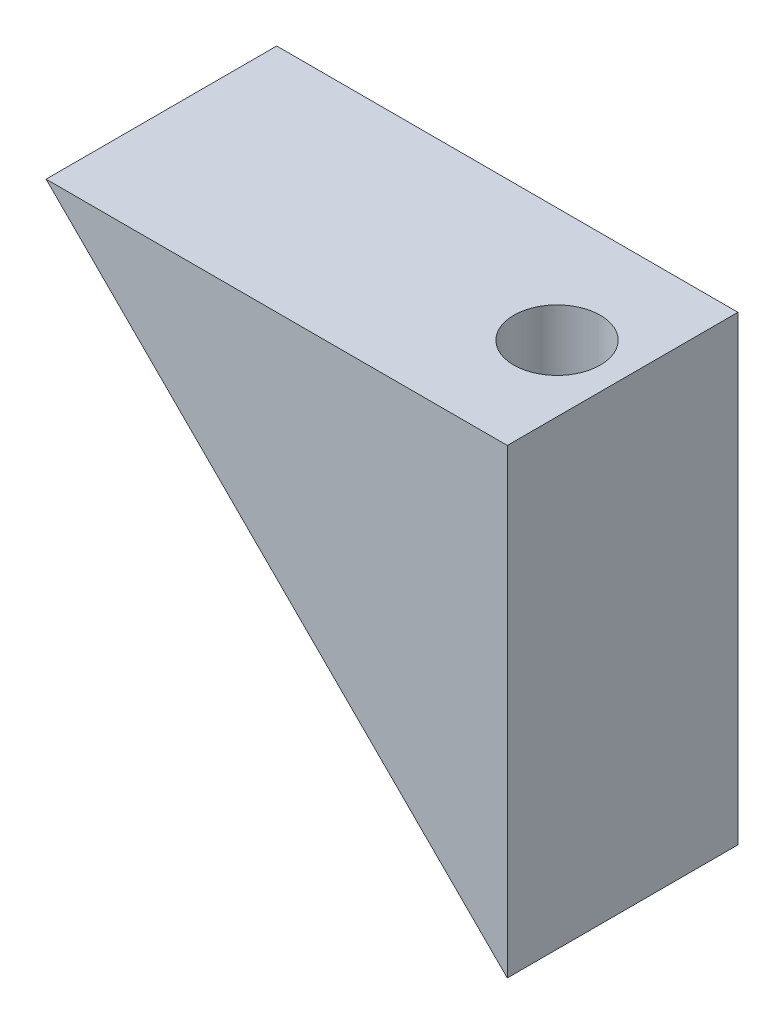
ISO-10303-21;
HEADER;
FILE_DESCRIPTION(('STEP AP214'),'2;1');
FILE_NAME('part.step','',(''),(''),'','','');
FILE_SCHEMA(('AUTOMOTIVE_DESIGN { 1 0 10303 214 1 1 1 1 }'));
ENDSEC;
DATA;
#1=APPLICATION_CONTEXT('core data for automotive mechanical design processes');
#2=APPLICATION_PROTOCOL_DEFINITION('international standard','automotive_design',2000,#1);
#3=PRODUCT_CONTEXT('',#1,'mechanical');
#4=PRODUCT('Part','Part','',(#3));
#5=PRODUCT_RELATED_PRODUCT_CATEGORY('part','',(#4));
#6=PRODUCT_DEFINITION_FORMATION('','',#4);
#7=PRODUCT_DEFINITION_CONTEXT('part definition',#1,'design');
#8=PRODUCT_DEFINITION('design','',#6,#7);
#9=PRODUCT_DEFINITION_SHAPE('','',#8);
#10=(LENGTH_UNIT() NAMED_UNIT(*) SI_UNIT(.MILLI.,.METRE.));
#11=(NAMED_UNIT(*) PLANE_ANGLE_UNIT() SI_UNIT($,.RADIAN.));
#12=(NAMED_UNIT(*) SI_UNIT($,.STERADIAN.) SOLID_ANGLE_UNIT());
#13=UNCERTAINTY_MEASURE_WITH_UNIT(LENGTH_MEASURE(1.E-05),#10,'distance_accuracy_value','');
#14=(GEOMETRIC_REPRESENTATION_CONTEXT(3) GLOBAL_UNCERTAINTY_ASSIGNED_CONTEXT((#13)) GLOBAL_UNIT_ASSIGNED_CONTEXT((#10,
#11,#12)) REPRESENTATION_CONTEXT('',''));
#15=CARTESIAN_POINT('',(0.,0.,0.));
#16=DIRECTION('',(0.,0.,1.));
#17=DIRECTION('',(1.,0.,0.));
#18=AXIS2_PLACEMENT_3D('',#15,#16,#17);
#19=CARTESIAN_POINT('',(80.,0.,80.));
#20=DIRECTION('',(1.,0.,0.));
#21=DIRECTION('',(0.,0.,-1.));
#22=AXIS2_PLACEMENT_3D('',#19,#20,#21);
#23=PLANE('',#22);
#24=DIRECTION('',(0.,-1.,0.));
#25=VECTOR('',#24,1.);
#26=CARTESIAN_POINT('',(80.,0.,0.));
#27=LINE('',#26,#25);
#28=CARTESIAN_POINT('',(80.,80.,0.));
#29=VERTEX_POINT('',#28);
#30=CARTESIAN_POINT('',(80.,-80.,0.));
#31=VERTEX_POINT('',#30);
#32=EDGE_CURVE('E77',#29,#31,#27,.T.);
#33=ORIENTED_EDGE('',*,*,#32,.F.);
#34=DIRECTION('',(0.,0.,-1.));
#35=VECTOR('',#34,1.);
#36=CARTESIAN_POINT('',(80.,80.,80.));
#37=LINE('',#36,#35);
#38=CARTESIAN_POINT('',(80.,80.,80.));
#39=VERTEX_POINT('',#38);
#40=EDGE_CURVE('E11',#39,#29,#37,.T.);
#41=ORIENTED_EDGE('',*,*,#40,.F.);
#42=DIRECTION('',(0.,-1.,0.));
#43=VECTOR('',#42,1.);
#44=CARTESIAN_POINT('',(80.,0.,80.));
#45=LINE('',#44,#43);
#46=CARTESIAN_POINT('',(80.,-80.,80.));
#47=VERTEX_POINT('',#46);
#48=EDGE_CURVE('E75',#39,#47,#45,.T.);
#49=ORIENTED_EDGE('',*,*,#48,.T.);
#50=DIRECTION('',(0.,0.,-1.));
#51=VECTOR('',#50,1.);
#52=CARTESIAN_POINT('',(80.,-80.,80.));
#53=LINE('',#52,#51);
#54=EDGE_CURVE('E59',#47,#31,#53,.T.);
#55=ORIENTED_EDGE('',*,*,#54,.T.);
#56=EDGE_LOOP('',(#33,#41,#49,#55));
#57=FACE_BOUND('',#56,.T.);
#58=ADVANCED_FACE('F41',(#57),#23,.T.);
#59=CARTESIAN_POINT('',(0.,80.,80.));
#60=DIRECTION('',(0.,1.,0.));
#61=DIRECTION('',(0.,0.,1.));
#62=AXIS2_PLACEMENT_3D('',#59,#60,#61);
#63=PLANE('',#62);
#64=CARTESIAN_POINT('',(57.,80.,39.75));
#65=DIRECTION('',(0.,1.,0.));
#66=DIRECTION('',(0.,0.,1.));
#67=AXIS2_PLACEMENT_3D('',#64,#65,#66);
#68=CIRCLE('',#67,15.);
#69=CARTESIAN_POINT('',(57.,80.,54.75));
#70=VERTEX_POINT('',#69);
#71=EDGE_CURVE('E196',#70,#70,#68,.T.);
#72=ORIENTED_EDGE('',*,*,#71,.F.);
#73=EDGE_LOOP('',(#72));
#74=FACE_BOUND('',#73,.T.);
#75=DIRECTION('',(1.,0.,0.));
#76=VECTOR('',#75,1.);
#77=CARTESIAN_POINT('',(0.,80.,0.));
#78=LINE('',#77,#76);
#79=CARTESIAN_POINT('',(-80.,80.,0.));
#80=VERTEX_POINT('',#79);
#81=EDGE_CURVE('E98',#80,#29,#78,.T.);
#82=ORIENTED_EDGE('',*,*,#81,.F.);
#83=DIRECTION('',(0.,0.,-1.));
#84=VECTOR('',#83,1.);
#85=CARTESIAN_POINT('',(-80.,80.,80.));
#86=LINE('',#85,#84);
#87=CARTESIAN_POINT('',(-80.,80.,80.));
#88=VERTEX_POINT('',#87);
#89=EDGE_CURVE('E51',#88,#80,#86,.T.);
#90=ORIENTED_EDGE('',*,*,#89,.F.);
#91=DIRECTION('',(1.,0.,0.));
#92=VECTOR('',#91,1.);
#93=CARTESIAN_POINT('',(0.,80.,80.));
#94=LINE('',#93,#92);
#95=EDGE_CURVE('E84',#88,#39,#94,.T.);
#96=ORIENTED_EDGE('',*,*,#95,.T.);
#97=ORIENTED_EDGE('',*,*,#40,.T.);
#98=EDGE_LOOP('',(#82,#90,#96,#97));
#99=FACE_BOUND('',#98,.T.);
#100=ADVANCED_FACE('F89',(#74,#99),#63,.T.);
#101=CARTESIAN_POINT('',(0.,0.,80.));
#102=DIRECTION('',(-0.707106781186548,-0.707106781186548,0.));
#103=DIRECTION('',(0.707106781186548,-0.707106781186548,0.));
#104=AXIS2_PLACEMENT_3D('',#101,#102,#103);
#105=PLANE('',#104);
#106=DIRECTION('',(-0.707106781186548,0.707106781186548,0.));
#107=VECTOR('',#106,1.);
#108=CARTESIAN_POINT('',(0.,0.,0.));
#109=LINE('',#108,#107);
#110=EDGE_CURVE('E87',#31,#80,#109,.T.);
#111=ORIENTED_EDGE('',*,*,#110,.F.);
#112=ORIENTED_EDGE('',*,*,#54,.F.);
#113=DIRECTION('',(-0.707106781186548,0.707106781186548,0.));
#114=VECTOR('',#113,1.);
#115=CARTESIAN_POINT('',(0.,0.,80.));
#116=LINE('',#115,#114);
#117=EDGE_CURVE('E85',#47,#88,#116,.T.);
#118=ORIENTED_EDGE('',*,*,#117,.T.);
#119=ORIENTED_EDGE('',*,*,#89,.T.);
#120=EDGE_LOOP('',(#111,#112,#118,#119));
#121=FACE_BOUND('',#120,.T.);
#122=ADVANCED_FACE('F110',(#121),#105,.T.);
#123=CARTESIAN_POINT('',(0.,0.,80.));
#124=DIRECTION('',(0.,0.,1.));
#125=DIRECTION('',(1.,0.,0.));
#126=AXIS2_PLACEMENT_3D('',#123,#124,#125);
#127=PLANE('',#126);
#128=ORIENTED_EDGE('',*,*,#48,.F.);
#129=ORIENTED_EDGE('',*,*,#95,.F.);
#130=ORIENTED_EDGE('',*,*,#117,.F.);
#131=EDGE_LOOP('',(#128,#129,#130));
#132=FACE_BOUND('',#131,.T.);
#133=ADVANCED_FACE('F83',(#132),#127,.T.);
#134=CARTESIAN_POINT('',(0.,0.,0.));
#135=DIRECTION('',(0.,0.,1.));
#136=DIRECTION('',(1.,0.,0.));
#137=AXIS2_PLACEMENT_3D('',#134,#135,#136);
#138=PLANE('',#137);
#139=ORIENTED_EDGE('',*,*,#32,.T.);
#140=ORIENTED_EDGE('',*,*,#110,.T.);
#141=ORIENTED_EDGE('',*,*,#81,.T.);
#142=EDGE_LOOP('',(#139,#140,#141));
#143=FACE_BOUND('',#142,.T.);
#144=ADVANCED_FACE('F109',(#143),#138,.F.);
#145=CARTESIAN_POINT('',(57.,45.,39.75));
#146=DIRECTION('',(0.,1.,0.));
#147=DIRECTION('',(0.,0.,1.));
#148=AXIS2_PLACEMENT_3D('',#145,#146,#147);
#149=CYLINDRICAL_SURFACE('',#148,15.);
#150=CARTESIAN_POINT('',(57.,45.,39.75));
#151=DIRECTION('',(0.,1.,0.));
#152=DIRECTION('',(0.,0.,1.));
#153=AXIS2_PLACEMENT_3D('',#150,#151,#152);
#154=CIRCLE('',#153,15.);
#155=CARTESIAN_POINT('',(57.,45.,54.75));
#156=VERTEX_POINT('',#155);
#157=EDGE_CURVE('E99',#156,#156,#154,.T.);
#158=ORIENTED_EDGE('',*,*,#157,.F.);
#159=EDGE_LOOP('',(#158));
#160=FACE_BOUND('',#159,.T.);
#161=ORIENTED_EDGE('',*,*,#71,.T.);
#162=EDGE_LOOP('',(#161));
#163=FACE_BOUND('',#162,.T.);
#164=ADVANCED_FACE('F138',(#160,#163),#149,.F.);
#165=CARTESIAN_POINT('',(57.,45.,39.75));
#166=DIRECTION('',(0.,1.,0.));
#167=DIRECTION('',(0.,0.,1.));
#168=AXIS2_PLACEMENT_3D('',#165,#166,#167);
#169=PLANE('',#168);
#170=CARTESIAN_POINT('',(57.,45.,39.75));
#171=DIRECTION('',(0.,1.,0.));
#172=DIRECTION('',(0.,0.,1.));
#173=AXIS2_PLACEMENT_3D('',#170,#171,#172);
#174=CIRCLE('',#173,9.74999999999999);
#175=CARTESIAN_POINT('',(57.,45.,49.5));
#176=VERTEX_POINT('',#175);
#177=EDGE_CURVE('E44',#176,#176,#174,.T.);
#178=ORIENTED_EDGE('',*,*,#177,.F.);
#179=EDGE_LOOP('',(#178));
#180=FACE_BOUND('',#179,.T.);
#181=ORIENTED_EDGE('',*,*,#157,.T.);
#182=EDGE_LOOP('',(#181));
#183=FACE_BOUND('',#182,.T.);
#184=ADVANCED_FACE('F143',(#180,#183),#169,.T.);
#185=CARTESIAN_POINT('',(57.,-40.,39.75));
#186=DIRECTION('',(0.,1.,0.));
#187=DIRECTION('',(0.,0.,1.));
#188=AXIS2_PLACEMENT_3D('',#185,#186,#187);
#189=CYLINDRICAL_SURFACE('',#188,9.74999999999999);
#190=ORIENTED_EDGE('',*,*,#177,.T.);
#191=EDGE_LOOP('',(#190));
#192=FACE_BOUND('',#191,.T.);
#193=CARTESIAN_POINT('',(57.,-40.,39.75));
#194=DIRECTION('',(0.,1.,0.));
#195=DIRECTION('',(0.,0.,1.));
#196=AXIS2_PLACEMENT_3D('',#193,#194,#195);
#197=CIRCLE('',#196,9.74999999999999);
#198=CARTESIAN_POINT('',(57.,-40.,49.5));
#199=VERTEX_POINT('',#198);
#200=EDGE_CURVE('E190',#199,#199,#197,.T.);
#201=ORIENTED_EDGE('',*,*,#200,.F.);
#202=EDGE_LOOP('',(#201));
#203=FACE_BOUND('',#202,.T.);
#204=ADVANCED_FACE('F153',(#192,#203),#189,.F.);
#205=CARTESIAN_POINT('',(57.,-40.,39.75));
#206=DIRECTION('',(0.,1.,0.));
#207=DIRECTION('',(0.,0.,1.));
#208=AXIS2_PLACEMENT_3D('',#205,#206,#207);
#209=PLANE('',#208);
#210=ORIENTED_EDGE('',*,*,#200,.T.);
#211=EDGE_LOOP('',(#210));
#212=FACE_BOUND('',#211,.T.);
#213=ADVANCED_FACE('F163',(#212),#209,.T.);
#214=CLOSED_SHELL('',(#58,#100,#122,#133,#144,#164,#184,#204,#213));
#215=MANIFOLD_SOLID_BREP('B2',#214);
#216=ADVANCED_BREP_SHAPE_REPRESENTATION('',(#18,#215),#14);
#217=SHAPE_DEFINITION_REPRESENTATION(#9,#216);
ENDSEC;
END-ISO-10303-21;
